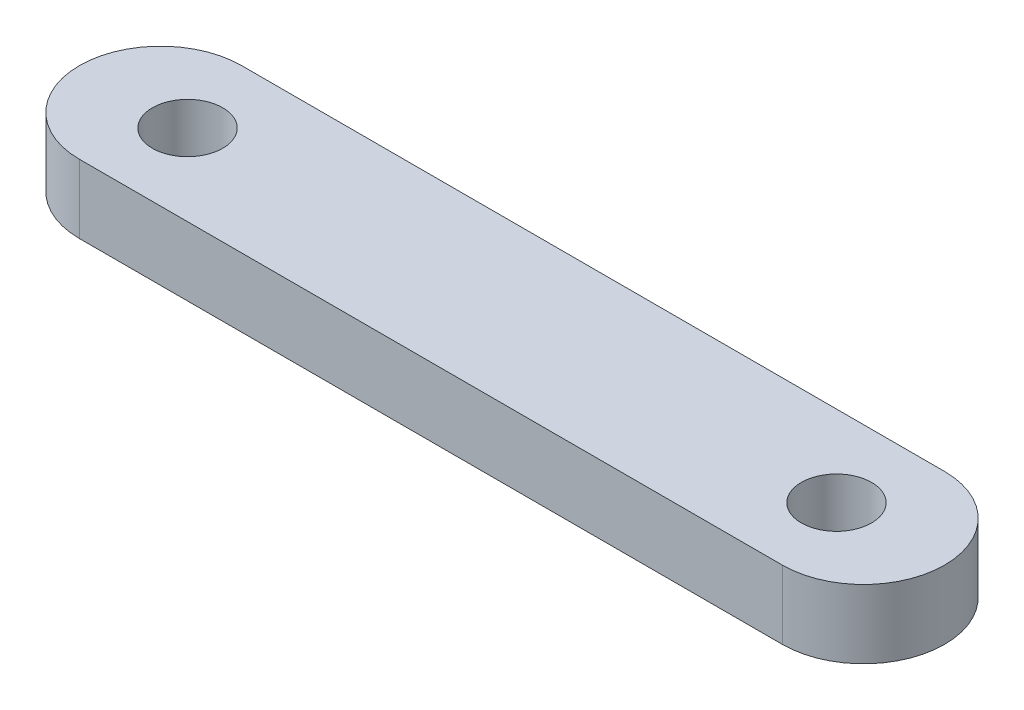
ISO-10303-21;
HEADER;
FILE_DESCRIPTION(('STEP AP214'),'2;1');
FILE_NAME('part.step','',(''),(''),'','','');
FILE_SCHEMA(('AUTOMOTIVE_DESIGN { 1 0 10303 214 1 1 1 1 }'));
ENDSEC;
DATA;
#1=APPLICATION_CONTEXT('core data for automotive mechanical design processes');
#2=APPLICATION_PROTOCOL_DEFINITION('international standard','automotive_design',2000,#1);
#3=PRODUCT_CONTEXT('',#1,'mechanical');
#4=PRODUCT('Part','Part','',(#3));
#5=PRODUCT_RELATED_PRODUCT_CATEGORY('part','',(#4));
#6=PRODUCT_DEFINITION_FORMATION('','',#4);
#7=PRODUCT_DEFINITION_CONTEXT('part definition',#1,'design');
#8=PRODUCT_DEFINITION('design','',#6,#7);
#9=PRODUCT_DEFINITION_SHAPE('','',#8);
#10=(LENGTH_UNIT() NAMED_UNIT(*) SI_UNIT(.MILLI.,.METRE.));
#11=(NAMED_UNIT(*) PLANE_ANGLE_UNIT() SI_UNIT($,.RADIAN.));
#12=(NAMED_UNIT(*) SI_UNIT($,.STERADIAN.) SOLID_ANGLE_UNIT());
#13=UNCERTAINTY_MEASURE_WITH_UNIT(LENGTH_MEASURE(1.E-05),#10,'distance_accuracy_value','');
#14=(GEOMETRIC_REPRESENTATION_CONTEXT(3) GLOBAL_UNCERTAINTY_ASSIGNED_CONTEXT((#13)) GLOBAL_UNIT_ASSIGNED_CONTEXT((#10,
#11,#12)) REPRESENTATION_CONTEXT('',''));
#15=CARTESIAN_POINT('',(0.,0.,0.));
#16=DIRECTION('',(0.,0.,1.));
#17=DIRECTION('',(1.,0.,0.));
#18=AXIS2_PLACEMENT_3D('',#15,#16,#17);
#19=CARTESIAN_POINT('',(32.5,6.35,0.));
#20=DIRECTION('',(0.,-1.,0.));
#21=DIRECTION('',(0.,0.,-1.));
#22=AXIS2_PLACEMENT_3D('',#19,#20,#21);
#23=CYLINDRICAL_SURFACE('',#22,7.5);
#24=DIRECTION('',(0.,-1.,0.));
#25=VECTOR('',#24,1.);
#26=CARTESIAN_POINT('',(32.5,6.35,-7.5));
#27=LINE('',#26,#25);
#28=CARTESIAN_POINT('',(32.5,6.35,-7.5));
#29=VERTEX_POINT('',#28);
#30=CARTESIAN_POINT('',(32.5,0.,-7.5));
#31=VERTEX_POINT('',#30);
#32=EDGE_CURVE('E79',#29,#31,#27,.T.);
#33=ORIENTED_EDGE('',*,*,#32,.F.);
#34=CARTESIAN_POINT('',(32.5,6.35,0.));
#35=DIRECTION('',(0.,1.,0.));
#36=DIRECTION('',(0.,0.,1.));
#37=AXIS2_PLACEMENT_3D('',#34,#35,#36);
#38=CIRCLE('',#37,7.5);
#39=CARTESIAN_POINT('',(32.5,6.35,7.5));
#40=VERTEX_POINT('',#39);
#41=EDGE_CURVE('E42',#40,#29,#38,.T.);
#42=ORIENTED_EDGE('',*,*,#41,.F.);
#43=DIRECTION('',(0.,-1.,0.));
#44=VECTOR('',#43,1.);
#45=CARTESIAN_POINT('',(32.5,6.35,7.5));
#46=LINE('',#45,#44);
#47=CARTESIAN_POINT('',(32.5,0.,7.5));
#48=VERTEX_POINT('',#47);
#49=EDGE_CURVE('E104',#48,#40,#46,.F.);
#50=ORIENTED_EDGE('',*,*,#49,.F.);
#51=CARTESIAN_POINT('',(32.5,0.,0.));
#52=DIRECTION('',(0.,1.,0.));
#53=DIRECTION('',(0.,0.,1.));
#54=AXIS2_PLACEMENT_3D('',#51,#52,#53);
#55=CIRCLE('',#54,7.5);
#56=EDGE_CURVE('E11',#31,#48,#55,.F.);
#57=ORIENTED_EDGE('',*,*,#56,.F.);
#58=EDGE_LOOP('',(#33,#42,#50,#57));
#59=FACE_BOUND('',#58,.T.);
#60=ADVANCED_FACE('F34',(#59),#23,.T.);
#61=CARTESIAN_POINT('',(-32.5,0.,0.));
#62=DIRECTION('',(0.,-1.,0.));
#63=DIRECTION('',(0.,0.,-1.));
#64=AXIS2_PLACEMENT_3D('',#61,#62,#63);
#65=CYLINDRICAL_SURFACE('',#64,7.5);
#66=DIRECTION('',(0.,-1.,0.));
#67=VECTOR('',#66,1.);
#68=CARTESIAN_POINT('',(-32.5,6.35,-7.5));
#69=LINE('',#68,#67);
#70=CARTESIAN_POINT('',(-32.5,0.,-7.5));
#71=VERTEX_POINT('',#70);
#72=CARTESIAN_POINT('',(-32.5,6.35,-7.5));
#73=VERTEX_POINT('',#72);
#74=EDGE_CURVE('E78',#71,#73,#69,.F.);
#75=ORIENTED_EDGE('',*,*,#74,.F.);
#76=CARTESIAN_POINT('',(-32.5,0.,0.));
#77=DIRECTION('',(0.,1.,0.));
#78=DIRECTION('',(0.,0.,1.));
#79=AXIS2_PLACEMENT_3D('',#76,#77,#78);
#80=CIRCLE('',#79,7.5);
#81=CARTESIAN_POINT('',(-32.5,0.,7.5));
#82=VERTEX_POINT('',#81);
#83=EDGE_CURVE('E83',#82,#71,#80,.F.);
#84=ORIENTED_EDGE('',*,*,#83,.F.);
#85=DIRECTION('',(0.,-1.,0.));
#86=VECTOR('',#85,1.);
#87=CARTESIAN_POINT('',(-32.5,6.35,7.5));
#88=LINE('',#87,#86);
#89=CARTESIAN_POINT('',(-32.5,6.35,7.5));
#90=VERTEX_POINT('',#89);
#91=EDGE_CURVE('E90',#90,#82,#88,.T.);
#92=ORIENTED_EDGE('',*,*,#91,.F.);
#93=CARTESIAN_POINT('',(-32.5,6.35,0.));
#94=DIRECTION('',(0.,1.,0.));
#95=DIRECTION('',(0.,0.,1.));
#96=AXIS2_PLACEMENT_3D('',#93,#94,#95);
#97=CIRCLE('',#96,7.5);
#98=EDGE_CURVE('E89',#73,#90,#97,.T.);
#99=ORIENTED_EDGE('',*,*,#98,.F.);
#100=EDGE_LOOP('',(#75,#84,#92,#99));
#101=FACE_BOUND('',#100,.T.);
#102=ADVANCED_FACE('F93',(#101),#65,.T.);
#103=CARTESIAN_POINT('',(-40.,6.35,-7.5));
#104=DIRECTION('',(0.,0.,1.));
#105=DIRECTION('',(1.,0.,0.));
#106=AXIS2_PLACEMENT_3D('',#103,#104,#105);
#107=PLANE('',#106);
#108=DIRECTION('',(-1.,0.,0.));
#109=VECTOR('',#108,1.);
#110=CARTESIAN_POINT('',(-40.,6.35,-7.5));
#111=LINE('',#110,#109);
#112=EDGE_CURVE('E98',#29,#73,#111,.T.);
#113=ORIENTED_EDGE('',*,*,#112,.F.);
#114=ORIENTED_EDGE('',*,*,#32,.T.);
#115=DIRECTION('',(-1.,0.,0.));
#116=VECTOR('',#115,1.);
#117=CARTESIAN_POINT('',(-40.,0.,-7.5));
#118=LINE('',#117,#116);
#119=EDGE_CURVE('E73',#31,#71,#118,.T.);
#120=ORIENTED_EDGE('',*,*,#119,.T.);
#121=ORIENTED_EDGE('',*,*,#74,.T.);
#122=EDGE_LOOP('',(#113,#114,#120,#121));
#123=FACE_BOUND('',#122,.T.);
#124=ADVANCED_FACE('F76',(#123),#107,.F.);
#125=CARTESIAN_POINT('',(-40.,6.35,7.5));
#126=DIRECTION('',(0.,0.,-1.));
#127=DIRECTION('',(-1.,0.,0.));
#128=AXIS2_PLACEMENT_3D('',#125,#126,#127);
#129=PLANE('',#128);
#130=DIRECTION('',(1.,0.,0.));
#131=VECTOR('',#130,1.);
#132=CARTESIAN_POINT('',(-40.,0.,7.5));
#133=LINE('',#132,#131);
#134=EDGE_CURVE('E80',#82,#48,#133,.T.);
#135=ORIENTED_EDGE('',*,*,#134,.T.);
#136=ORIENTED_EDGE('',*,*,#49,.T.);
#137=DIRECTION('',(1.,0.,0.));
#138=VECTOR('',#137,1.);
#139=CARTESIAN_POINT('',(-40.,6.35,7.5));
#140=LINE('',#139,#138);
#141=EDGE_CURVE('E94',#90,#40,#140,.T.);
#142=ORIENTED_EDGE('',*,*,#141,.F.);
#143=ORIENTED_EDGE('',*,*,#91,.T.);
#144=EDGE_LOOP('',(#135,#136,#142,#143));
#145=FACE_BOUND('',#144,.T.);
#146=ADVANCED_FACE('F133',(#145),#129,.F.);
#147=CARTESIAN_POINT('',(0.,6.35,0.));
#148=DIRECTION('',(0.,1.,0.));
#149=DIRECTION('',(0.,0.,1.));
#150=AXIS2_PLACEMENT_3D('',#147,#148,#149);
#151=PLANE('',#150);
#152=CARTESIAN_POINT('',(-30.,6.35,0.));
#153=DIRECTION('',(0.,1.,0.));
#154=DIRECTION('',(0.,0.,1.));
#155=AXIS2_PLACEMENT_3D('',#152,#153,#154);
#156=CIRCLE('',#155,3.25);
#157=CARTESIAN_POINT('',(-30.,6.35,3.25));
#158=VERTEX_POINT('',#157);
#159=EDGE_CURVE('E116',#158,#158,#156,.T.);
#160=ORIENTED_EDGE('',*,*,#159,.F.);
#161=EDGE_LOOP('',(#160));
#162=FACE_BOUND('',#161,.T.);
#163=CARTESIAN_POINT('',(30.,6.35,0.));
#164=DIRECTION('',(0.,1.,0.));
#165=DIRECTION('',(0.,0.,1.));
#166=AXIS2_PLACEMENT_3D('',#163,#164,#165);
#167=CIRCLE('',#166,3.25);
#168=CARTESIAN_POINT('',(30.,6.35,3.25));
#169=VERTEX_POINT('',#168);
#170=EDGE_CURVE('E113',#169,#169,#167,.T.);
#171=ORIENTED_EDGE('',*,*,#170,.F.);
#172=EDGE_LOOP('',(#171));
#173=FACE_BOUND('',#172,.T.);
#174=ORIENTED_EDGE('',*,*,#141,.T.);
#175=ORIENTED_EDGE('',*,*,#41,.T.);
#176=ORIENTED_EDGE('',*,*,#112,.T.);
#177=ORIENTED_EDGE('',*,*,#98,.T.);
#178=EDGE_LOOP('',(#174,#175,#176,#177));
#179=FACE_BOUND('',#178,.T.);
#180=ADVANCED_FACE('F106',(#162,#173,#179),#151,.T.);
#181=CARTESIAN_POINT('',(0.,0.,0.));
#182=DIRECTION('',(0.,1.,0.));
#183=DIRECTION('',(0.,0.,1.));
#184=AXIS2_PLACEMENT_3D('',#181,#182,#183);
#185=PLANE('',#184);
#186=CARTESIAN_POINT('',(-30.,0.,0.));
#187=DIRECTION('',(0.,1.,0.));
#188=DIRECTION('',(0.,0.,1.));
#189=AXIS2_PLACEMENT_3D('',#186,#187,#188);
#190=CIRCLE('',#189,3.25);
#191=CARTESIAN_POINT('',(-30.,0.,3.25));
#192=VERTEX_POINT('',#191);
#193=EDGE_CURVE('E81',#192,#192,#190,.T.);
#194=ORIENTED_EDGE('',*,*,#193,.T.);
#195=EDGE_LOOP('',(#194));
#196=FACE_BOUND('',#195,.T.);
#197=CARTESIAN_POINT('',(30.,0.,0.));
#198=DIRECTION('',(0.,1.,0.));
#199=DIRECTION('',(0.,0.,1.));
#200=AXIS2_PLACEMENT_3D('',#197,#198,#199);
#201=CIRCLE('',#200,3.25);
#202=CARTESIAN_POINT('',(30.,0.,3.25));
#203=VERTEX_POINT('',#202);
#204=EDGE_CURVE('E110',#203,#203,#201,.T.);
#205=ORIENTED_EDGE('',*,*,#204,.T.);
#206=EDGE_LOOP('',(#205));
#207=FACE_BOUND('',#206,.T.);
#208=ORIENTED_EDGE('',*,*,#119,.F.);
#209=ORIENTED_EDGE('',*,*,#56,.T.);
#210=ORIENTED_EDGE('',*,*,#134,.F.);
#211=ORIENTED_EDGE('',*,*,#83,.T.);
#212=EDGE_LOOP('',(#208,#209,#210,#211));
#213=FACE_BOUND('',#212,.T.);
#214=ADVANCED_FACE('F84',(#196,#207,#213),#185,.F.);
#215=CARTESIAN_POINT('',(30.,0.,0.));
#216=DIRECTION('',(0.,1.,0.));
#217=DIRECTION('',(0.,0.,1.));
#218=AXIS2_PLACEMENT_3D('',#215,#216,#217);
#219=CYLINDRICAL_SURFACE('',#218,3.25);
#220=ORIENTED_EDGE('',*,*,#204,.F.);
#221=EDGE_LOOP('',(#220));
#222=FACE_BOUND('',#221,.T.);
#223=ORIENTED_EDGE('',*,*,#170,.T.);
#224=EDGE_LOOP('',(#223));
#225=FACE_BOUND('',#224,.T.);
#226=ADVANCED_FACE('F127',(#222,#225),#219,.F.);
#227=CARTESIAN_POINT('',(-30.,0.,0.));
#228=DIRECTION('',(0.,1.,0.));
#229=DIRECTION('',(0.,0.,1.));
#230=AXIS2_PLACEMENT_3D('',#227,#228,#229);
#231=CYLINDRICAL_SURFACE('',#230,3.25);
#232=ORIENTED_EDGE('',*,*,#193,.F.);
#233=EDGE_LOOP('',(#232));
#234=FACE_BOUND('',#233,.T.);
#235=ORIENTED_EDGE('',*,*,#159,.T.);
#236=EDGE_LOOP('',(#235));
#237=FACE_BOUND('',#236,.T.);
#238=ADVANCED_FACE('F124',(#234,#237),#231,.F.);
#239=CLOSED_SHELL('',(#60,#102,#124,#146,#180,#214,#226,#238));
#240=MANIFOLD_SOLID_BREP('B2',#239);
#241=ADVANCED_BREP_SHAPE_REPRESENTATION('',(#18,#240),#14);
#242=SHAPE_DEFINITION_REPRESENTATION(#9,#241);
ENDSEC;
END-ISO-10303-21;
